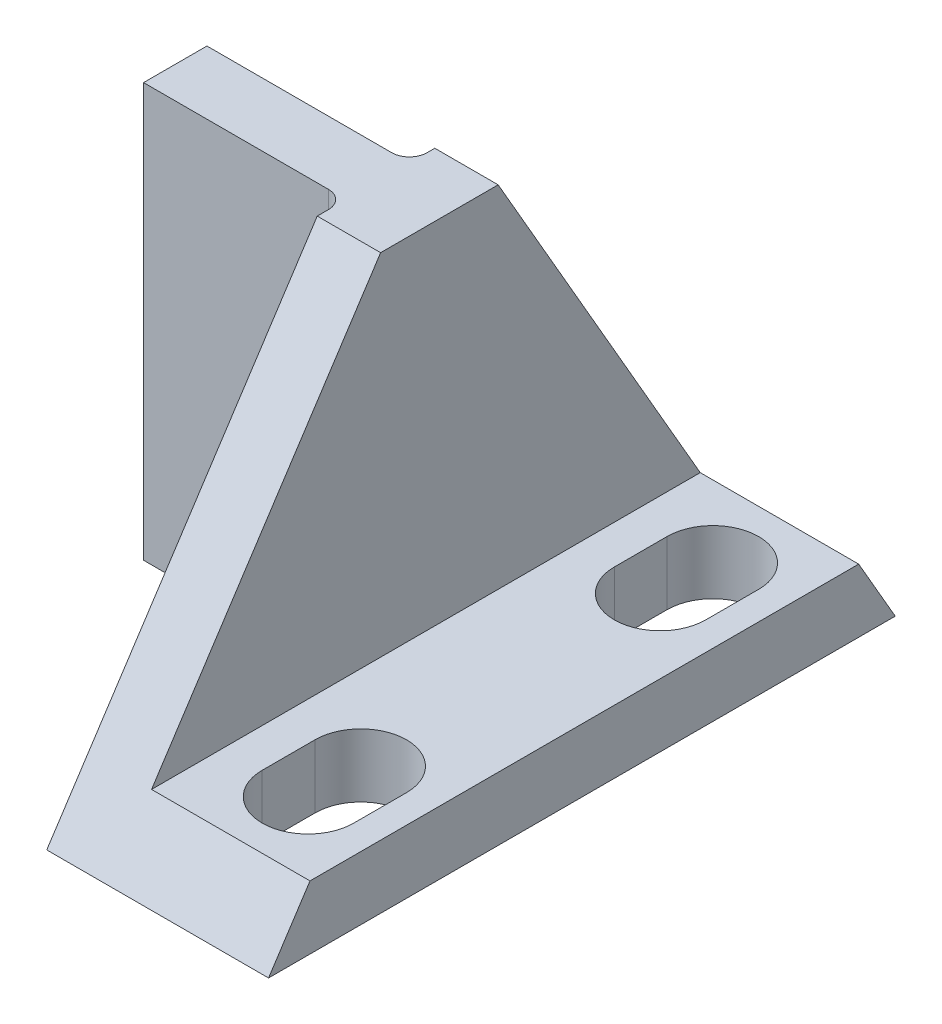
ISO-10303-21;
HEADER;
FILE_DESCRIPTION(('STEP AP214'),'2;1');
FILE_NAME('part.step','',(''),(''),'','','');
FILE_SCHEMA(('AUTOMOTIVE_DESIGN { 1 0 10303 214 1 1 1 1 }'));
ENDSEC;
DATA;
#1=APPLICATION_CONTEXT('core data for automotive mechanical design processes');
#2=APPLICATION_PROTOCOL_DEFINITION('international standard','automotive_design',2000,#1);
#3=PRODUCT_CONTEXT('',#1,'mechanical');
#4=PRODUCT('Part','Part','',(#3));
#5=PRODUCT_RELATED_PRODUCT_CATEGORY('part','',(#4));
#6=PRODUCT_DEFINITION_FORMATION('','',#4);
#7=PRODUCT_DEFINITION_CONTEXT('part definition',#1,'design');
#8=PRODUCT_DEFINITION('design','',#6,#7);
#9=PRODUCT_DEFINITION_SHAPE('','',#8);
#10=(LENGTH_UNIT() NAMED_UNIT(*) SI_UNIT(.MILLI.,.METRE.));
#11=(NAMED_UNIT(*) PLANE_ANGLE_UNIT() SI_UNIT($,.RADIAN.));
#12=(NAMED_UNIT(*) SI_UNIT($,.STERADIAN.) SOLID_ANGLE_UNIT());
#13=UNCERTAINTY_MEASURE_WITH_UNIT(LENGTH_MEASURE(1.E-05),#10,'distance_accuracy_value','');
#14=(GEOMETRIC_REPRESENTATION_CONTEXT(3) GLOBAL_UNCERTAINTY_ASSIGNED_CONTEXT((#13)) GLOBAL_UNIT_ASSIGNED_CONTEXT((#10,
#11,#12)) REPRESENTATION_CONTEXT('',''));
#15=CARTESIAN_POINT('',(0.,0.,0.));
#16=DIRECTION('',(0.,0.,1.));
#17=DIRECTION('',(1.,0.,0.));
#18=AXIS2_PLACEMENT_3D('',#15,#16,#17);
#19=CARTESIAN_POINT('',(0.,0.,4.572));
#20=DIRECTION('',(1.,0.,0.));
#21=DIRECTION('',(0.,0.,-1.));
#22=AXIS2_PLACEMENT_3D('',#19,#20,#21);
#23=PLANE('',#22);
#24=CARTESIAN_POINT('',(0.,13.97,2.286));
#25=DIRECTION('',(-1.,0.,0.));
#26=DIRECTION('',(0.,0.,1.));
#27=AXIS2_PLACEMENT_3D('',#24,#25,#26);
#28=CIRCLE('',#27,1.25);
#29=CARTESIAN_POINT('',(0.,13.97,3.536));
#30=VERTEX_POINT('',#29);
#31=EDGE_CURVE('E174',#30,#30,#28,.T.);
#32=ORIENTED_EDGE('',*,*,#31,.F.);
#33=EDGE_LOOP('',(#32));
#34=FACE_BOUND('',#33,.T.);
#35=CARTESIAN_POINT('',(0.,26.67,2.286));
#36=DIRECTION('',(-1.,0.,0.));
#37=DIRECTION('',(0.,0.,1.));
#38=AXIS2_PLACEMENT_3D('',#35,#36,#37);
#39=CIRCLE('',#38,1.25000004);
#40=CARTESIAN_POINT('',(0.,26.67,3.53600004));
#41=VERTEX_POINT('',#40);
#42=EDGE_CURVE('E345',#41,#41,#39,.T.);
#43=ORIENTED_EDGE('',*,*,#42,.F.);
#44=EDGE_LOOP('',(#43));
#45=FACE_BOUND('',#44,.T.);
#46=DIRECTION('',(0.,0.,1.));
#47=VECTOR('',#46,1.);
#48=CARTESIAN_POINT('',(0.,29.845,-6.0398679210479));
#49=LINE('',#48,#47);
#50=CARTESIAN_POINT('',(0.,29.845,0.));
#51=VERTEX_POINT('',#50);
#52=CARTESIAN_POINT('',(0.,29.845,4.572));
#53=VERTEX_POINT('',#52);
#54=EDGE_CURVE('E171',#51,#53,#49,.T.);
#55=ORIENTED_EDGE('',*,*,#54,.F.);
#56=DIRECTION('',(0.,-1.,0.));
#57=VECTOR('',#56,1.);
#58=CARTESIAN_POINT('',(0.,0.,0.));
#59=LINE('',#58,#57);
#60=CARTESIAN_POINT('',(0.,0.,0.));
#61=VERTEX_POINT('',#60);
#62=EDGE_CURVE('E180',#51,#61,#59,.T.);
#63=ORIENTED_EDGE('',*,*,#62,.T.);
#64=DIRECTION('',(0.,0.,-1.));
#65=VECTOR('',#64,1.);
#66=CARTESIAN_POINT('',(0.,0.,4.572));
#67=LINE('',#66,#65);
#68=CARTESIAN_POINT('',(0.,0.,4.572));
#69=VERTEX_POINT('',#68);
#70=EDGE_CURVE('E197',#69,#61,#67,.T.);
#71=ORIENTED_EDGE('',*,*,#70,.F.);
#72=DIRECTION('',(0.,-1.,0.));
#73=VECTOR('',#72,1.);
#74=CARTESIAN_POINT('',(0.,0.,4.572));
#75=LINE('',#74,#73);
#76=EDGE_CURVE('E181',#53,#69,#75,.T.);
#77=ORIENTED_EDGE('',*,*,#76,.F.);
#78=EDGE_LOOP('',(#55,#63,#71,#77));
#79=FACE_BOUND('',#78,.T.);
#80=ADVANCED_FACE('F34',(#34,#45,#79),#23,.F.);
#81=CARTESIAN_POINT('',(0.,0.,4.572));
#82=DIRECTION('',(0.,0.,-1.));
#83=DIRECTION('',(-1.,0.,0.));
#84=AXIS2_PLACEMENT_3D('',#81,#82,#83);
#85=PLANE('',#84);
#86=DIRECTION('',(1.,0.,0.));
#87=VECTOR('',#86,1.);
#88=CARTESIAN_POINT('',(0.,0.,4.572));
#89=LINE('',#88,#87);
#90=CARTESIAN_POINT('',(13.335,0.,4.572));
#91=VERTEX_POINT('',#90);
#92=EDGE_CURVE('E194',#69,#91,#89,.T.);
#93=ORIENTED_EDGE('',*,*,#92,.T.);
#94=DIRECTION('',(0.,1.,0.));
#95=VECTOR('',#94,1.);
#96=CARTESIAN_POINT('',(13.335,29.845,4.572));
#97=LINE('',#96,#95);
#98=CARTESIAN_POINT('',(13.335,29.845,4.572));
#99=VERTEX_POINT('',#98);
#100=EDGE_CURVE('E201',#91,#99,#97,.T.);
#101=ORIENTED_EDGE('',*,*,#100,.T.);
#102=DIRECTION('',(1.,0.,0.));
#103=VECTOR('',#102,1.);
#104=CARTESIAN_POINT('',(0.,29.845,4.572));
#105=LINE('',#104,#103);
#106=EDGE_CURVE('E229',#53,#99,#105,.T.);
#107=ORIENTED_EDGE('',*,*,#106,.F.);
#108=ORIENTED_EDGE('',*,*,#76,.T.);
#109=EDGE_LOOP('',(#93,#101,#107,#108));
#110=FACE_BOUND('',#109,.T.);
#111=ADVANCED_FACE('F225',(#110),#85,.F.);
#112=CARTESIAN_POINT('',(0.,0.,0.));
#113=DIRECTION('',(0.,0.,-1.));
#114=DIRECTION('',(-1.,0.,0.));
#115=AXIS2_PLACEMENT_3D('',#112,#113,#114);
#116=PLANE('',#115);
#117=DIRECTION('',(1.,0.,0.));
#118=VECTOR('',#117,1.);
#119=CARTESIAN_POINT('',(0.,29.845,0.));
#120=LINE('',#119,#118);
#121=CARTESIAN_POINT('',(13.335,29.845,0.));
#122=VERTEX_POINT('',#121);
#123=EDGE_CURVE('E167',#51,#122,#120,.T.);
#124=ORIENTED_EDGE('',*,*,#123,.T.);
#125=DIRECTION('',(0.,1.,0.));
#126=VECTOR('',#125,1.);
#127=CARTESIAN_POINT('',(13.335,0.,0.));
#128=LINE('',#127,#126);
#129=CARTESIAN_POINT('',(13.335,0.,0.));
#130=VERTEX_POINT('',#129);
#131=EDGE_CURVE('E49',#122,#130,#128,.F.);
#132=ORIENTED_EDGE('',*,*,#131,.T.);
#133=DIRECTION('',(1.,0.,0.));
#134=VECTOR('',#133,1.);
#135=CARTESIAN_POINT('',(0.,0.,0.));
#136=LINE('',#135,#134);
#137=EDGE_CURVE('E185',#61,#130,#136,.T.);
#138=ORIENTED_EDGE('',*,*,#137,.F.);
#139=ORIENTED_EDGE('',*,*,#62,.F.);
#140=EDGE_LOOP('',(#124,#132,#138,#139));
#141=FACE_BOUND('',#140,.T.);
#142=ADVANCED_FACE('F184',(#141),#116,.T.);
#143=CARTESIAN_POINT('',(14.605,0.,0.));
#144=DIRECTION('',(1.,0.,0.));
#145=DIRECTION('',(0.,0.,-1.));
#146=AXIS2_PLACEMENT_3D('',#143,#144,#145);
#147=PLANE('',#146);
#148=DIRECTION('',(0.,0.,-1.));
#149=VECTOR('',#148,1.);
#150=CARTESIAN_POINT('',(14.605,0.,26.162));
#151=LINE('',#150,#149);
#152=CARTESIAN_POINT('',(14.605,0.,-1.26999999999999));
#153=VERTEX_POINT('',#152);
#154=CARTESIAN_POINT('',(14.605,0.,-19.05));
#155=VERTEX_POINT('',#154);
#156=EDGE_CURVE('E235',#153,#155,#151,.T.);
#157=ORIENTED_EDGE('',*,*,#156,.F.);
#158=DIRECTION('',(0.,1.,0.));
#159=VECTOR('',#158,1.);
#160=CARTESIAN_POINT('',(14.605,0.,-1.27));
#161=LINE('',#160,#159);
#162=CARTESIAN_POINT('',(14.605,29.845,-1.27));
#163=VERTEX_POINT('',#162);
#164=EDGE_CURVE('E206',#153,#163,#161,.T.);
#165=ORIENTED_EDGE('',*,*,#164,.T.);
#166=DIRECTION('',(0.,0.,1.));
#167=VECTOR('',#166,1.);
#168=CARTESIAN_POINT('',(14.605,29.845,0.));
#169=LINE('',#168,#167);
#170=CARTESIAN_POINT('',(14.605,29.845,-1.83173076923077));
#171=VERTEX_POINT('',#170);
#172=EDGE_CURVE('E175',#171,#163,#169,.T.);
#173=ORIENTED_EDGE('',*,*,#172,.F.);
#174=DIRECTION('',(0.,0.866185586048601,0.499722453489577));
#175=VECTOR('',#174,1.);
#176=CARTESIAN_POINT('',(14.605,0.,-19.05));
#177=LINE('',#176,#175);
#178=EDGE_CURVE('E246',#155,#171,#177,.T.);
#179=ORIENTED_EDGE('',*,*,#178,.F.);
#180=EDGE_LOOP('',(#157,#165,#173,#179));
#181=FACE_BOUND('',#180,.T.);
#182=ADVANCED_FACE('F369',(#181),#147,.F.);
#183=CARTESIAN_POINT('',(19.177,33.02,4.572));
#184=DIRECTION('',(0.,-0.547249362982703,-0.836969613973546));
#185=DIRECTION('',(0.,0.836969613973546,-0.547249362982703));
#186=AXIS2_PLACEMENT_3D('',#183,#184,#185);
#187=PLANE('',#186);
#188=DIRECTION('',(1.,0.,0.));
#189=VECTOR('',#188,1.);
#190=CARTESIAN_POINT('',(19.177,29.845,6.64796153846154));
#191=LINE('',#190,#189);
#192=CARTESIAN_POINT('',(14.605,29.845,6.64796153846154));
#193=VERTEX_POINT('',#192);
#194=CARTESIAN_POINT('',(19.177,29.845,6.64796153846154));
#195=VERTEX_POINT('',#194);
#196=EDGE_CURVE('E182',#193,#195,#191,.T.);
#197=ORIENTED_EDGE('',*,*,#196,.F.);
#198=DIRECTION('',(0.,-0.836969613973546,0.547249362982703));
#199=VECTOR('',#198,1.);
#200=CARTESIAN_POINT('',(14.605,33.02,4.572));
#201=LINE('',#200,#199);
#202=CARTESIAN_POINT('',(14.605,0.,26.162));
#203=VERTEX_POINT('',#202);
#204=EDGE_CURVE('E233',#193,#203,#201,.T.);
#205=ORIENTED_EDGE('',*,*,#204,.T.);
#206=DIRECTION('',(-1.,0.,0.));
#207=VECTOR('',#206,1.);
#208=CARTESIAN_POINT('',(19.177,0.,26.162));
#209=LINE('',#208,#207);
#210=CARTESIAN_POINT('',(30.607,0.,26.162));
#211=VERTEX_POINT('',#210);
#212=EDGE_CURVE('E187',#211,#203,#209,.T.);
#213=ORIENTED_EDGE('',*,*,#212,.F.);
#214=DIRECTION('',(0.,-0.836969613973546,0.547249362982702));
#215=VECTOR('',#214,1.);
#216=CARTESIAN_POINT('',(30.607,0.,26.162));
#217=LINE('',#216,#215);
#218=CARTESIAN_POINT('',(30.607,4.57199999999999,23.1726153846154));
#219=VERTEX_POINT('',#218);
#220=EDGE_CURVE('E266',#219,#211,#217,.T.);
#221=ORIENTED_EDGE('',*,*,#220,.F.);
#222=DIRECTION('',(-1.,0.,0.));
#223=VECTOR('',#222,1.);
#224=CARTESIAN_POINT('',(30.607,4.57199999999999,23.1726153846154));
#225=LINE('',#224,#223);
#226=CARTESIAN_POINT('',(19.177,4.57199999999999,23.1726153846154));
#227=VERTEX_POINT('',#226);
#228=EDGE_CURVE('E240',#219,#227,#225,.T.);
#229=ORIENTED_EDGE('',*,*,#228,.T.);
#230=DIRECTION('',(0.,-0.836969613973546,0.547249362982703));
#231=VECTOR('',#230,1.);
#232=CARTESIAN_POINT('',(19.177,33.02,4.572));
#233=LINE('',#232,#231);
#234=EDGE_CURVE('E249',#195,#227,#233,.T.);
#235=ORIENTED_EDGE('',*,*,#234,.F.);
#236=EDGE_LOOP('',(#197,#205,#213,#221,#229,#235));
#237=FACE_BOUND('',#236,.T.);
#238=ADVANCED_FACE('F358',(#237),#187,.F.);
#239=CARTESIAN_POINT('',(19.177,0.,-19.05));
#240=DIRECTION('',(0.,-0.499722453489577,0.8661855860486));
#241=DIRECTION('',(0.,-0.8661855860486,-0.499722453489577));
#242=AXIS2_PLACEMENT_3D('',#239,#240,#241);
#243=PLANE('',#242);
#244=DIRECTION('',(-1.,0.,0.));
#245=VECTOR('',#244,1.);
#246=CARTESIAN_POINT('',(19.177,29.845,-1.83173076923077));
#247=LINE('',#246,#245);
#248=CARTESIAN_POINT('',(19.177,29.845,-1.83173076923077));
#249=VERTEX_POINT('',#248);
#250=EDGE_CURVE('E351',#249,#171,#247,.T.);
#251=ORIENTED_EDGE('',*,*,#250,.F.);
#252=DIRECTION('',(0.,0.866185586048601,0.499722453489577));
#253=VECTOR('',#252,1.);
#254=CARTESIAN_POINT('',(19.177,0.,-19.05));
#255=LINE('',#254,#253);
#256=CARTESIAN_POINT('',(19.177,4.572,-16.4123076923077));
#257=VERTEX_POINT('',#256);
#258=EDGE_CURVE('E243',#257,#249,#255,.T.);
#259=ORIENTED_EDGE('',*,*,#258,.F.);
#260=DIRECTION('',(-1.,0.,0.));
#261=VECTOR('',#260,1.);
#262=CARTESIAN_POINT('',(30.607,4.57199999999999,-16.4123076923077));
#263=LINE('',#262,#261);
#264=CARTESIAN_POINT('',(30.607,4.57199999999999,-16.4123076923077));
#265=VERTEX_POINT('',#264);
#266=EDGE_CURVE('E236',#265,#257,#263,.T.);
#267=ORIENTED_EDGE('',*,*,#266,.F.);
#268=DIRECTION('',(0.,0.866185586048601,0.499722453489577));
#269=VECTOR('',#268,1.);
#270=CARTESIAN_POINT('',(30.607,4.57199999999999,-16.4123076923077));
#271=LINE('',#270,#269);
#272=CARTESIAN_POINT('',(30.607,0.,-19.05));
#273=VERTEX_POINT('',#272);
#274=EDGE_CURVE('E269',#273,#265,#271,.T.);
#275=ORIENTED_EDGE('',*,*,#274,.F.);
#276=DIRECTION('',(-1.,0.,0.));
#277=VECTOR('',#276,1.);
#278=CARTESIAN_POINT('',(19.177,0.,-19.05));
#279=LINE('',#278,#277);
#280=EDGE_CURVE('E191',#273,#155,#279,.T.);
#281=ORIENTED_EDGE('',*,*,#280,.T.);
#282=ORIENTED_EDGE('',*,*,#178,.T.);
#283=EDGE_LOOP('',(#251,#259,#267,#275,#281,#282));
#284=FACE_BOUND('',#283,.T.);
#285=ADVANCED_FACE('F365',(#284),#243,.F.);
#286=CARTESIAN_POINT('',(19.177,0.,0.));
#287=DIRECTION('',(1.,0.,0.));
#288=DIRECTION('',(0.,0.,-1.));
#289=AXIS2_PLACEMENT_3D('',#286,#287,#288);
#290=PLANE('',#289);
#291=ORIENTED_EDGE('',*,*,#258,.T.);
#292=DIRECTION('',(0.,0.,1.));
#293=VECTOR('',#292,1.);
#294=CARTESIAN_POINT('',(19.177,29.845,0.));
#295=LINE('',#294,#293);
#296=EDGE_CURVE('E353',#249,#195,#295,.T.);
#297=ORIENTED_EDGE('',*,*,#296,.T.);
#298=ORIENTED_EDGE('',*,*,#234,.T.);
#299=DIRECTION('',(0.,0.,1.));
#300=VECTOR('',#299,1.);
#301=CARTESIAN_POINT('',(19.177,4.57199999999999,23.1726153846154));
#302=LINE('',#301,#300);
#303=EDGE_CURVE('E264',#257,#227,#302,.T.);
#304=ORIENTED_EDGE('',*,*,#303,.F.);
#305=EDGE_LOOP('',(#291,#297,#298,#304));
#306=FACE_BOUND('',#305,.T.);
#307=ADVANCED_FACE('F357',(#306),#290,.T.);
#308=DIRECTION('',(0.,0.,1.));
#309=VECTOR('',#308,1.);
#310=CARTESIAN_POINT('',(14.605,29.845,0.));
#311=LINE('',#310,#309);
#312=CARTESIAN_POINT('',(14.605,29.845,5.842));
#313=VERTEX_POINT('',#312);
#314=EDGE_CURVE('E199',#313,#193,#311,.T.);
#315=ORIENTED_EDGE('',*,*,#314,.F.);
#316=DIRECTION('',(0.,1.,0.));
#317=VECTOR('',#316,1.);
#318=CARTESIAN_POINT('',(14.605,0.,5.842));
#319=LINE('',#318,#317);
#320=CARTESIAN_POINT('',(14.605,0.,5.84200000000001));
#321=VERTEX_POINT('',#320);
#322=EDGE_CURVE('E204',#313,#321,#319,.F.);
#323=ORIENTED_EDGE('',*,*,#322,.T.);
#324=EDGE_CURVE('E220',#203,#321,#151,.T.);
#325=ORIENTED_EDGE('',*,*,#324,.F.);
#326=ORIENTED_EDGE('',*,*,#204,.F.);
#327=EDGE_LOOP('',(#315,#323,#325,#326));
#328=FACE_BOUND('',#327,.T.);
#329=ADVANCED_FACE('F232',(#328),#147,.F.);
#330=CARTESIAN_POINT('',(0.,0.,4.572));
#331=DIRECTION('',(0.,1.,0.));
#332=DIRECTION('',(0.,0.,1.));
#333=AXIS2_PLACEMENT_3D('',#330,#331,#332);
#334=PLANE('',#333);
#335=DIRECTION('',(0.,0.,-1.));
#336=VECTOR('',#335,1.);
#337=CARTESIAN_POINT('',(28.575,0.,-11.2248461538462));
#338=LINE('',#337,#336);
#339=CARTESIAN_POINT('',(28.575,0.,-7.41484615384615));
#340=VERTEX_POINT('',#339);
#341=CARTESIAN_POINT('',(28.575,0.,-11.2248461538462));
#342=VERTEX_POINT('',#341);
#343=EDGE_CURVE('E314',#340,#342,#338,.T.);
#344=ORIENTED_EDGE('',*,*,#343,.T.);
#345=CARTESIAN_POINT('',(25.273,0.,-11.2248461538462));
#346=DIRECTION('',(0.,1.,0.));
#347=DIRECTION('',(0.,0.,1.));
#348=AXIS2_PLACEMENT_3D('',#345,#346,#347);
#349=CIRCLE('',#348,3.302);
#350=CARTESIAN_POINT('',(21.971,0.,-11.2248461538461));
#351=VERTEX_POINT('',#350);
#352=EDGE_CURVE('E322',#342,#351,#349,.T.);
#353=ORIENTED_EDGE('',*,*,#352,.T.);
#354=DIRECTION('',(0.,0.,1.));
#355=VECTOR('',#354,1.);
#356=CARTESIAN_POINT('',(21.971,0.,-11.2248461538461));
#357=LINE('',#356,#355);
#358=CARTESIAN_POINT('',(21.971,0.,-7.41484615384615));
#359=VERTEX_POINT('',#358);
#360=EDGE_CURVE('E335',#351,#359,#357,.T.);
#361=ORIENTED_EDGE('',*,*,#360,.T.);
#362=CARTESIAN_POINT('',(25.273,0.,-7.41484615384615));
#363=DIRECTION('',(0.,1.,0.));
#364=DIRECTION('',(0.,0.,1.));
#365=AXIS2_PLACEMENT_3D('',#362,#363,#364);
#366=CIRCLE('',#365,3.302);
#367=EDGE_CURVE('E332',#359,#340,#366,.T.);
#368=ORIENTED_EDGE('',*,*,#367,.T.);
#369=EDGE_LOOP('',(#344,#353,#361,#368));
#370=FACE_BOUND('',#369,.T.);
#371=DIRECTION('',(0.,0.,-1.));
#372=VECTOR('',#371,1.);
#373=CARTESIAN_POINT('',(28.575,0.,14.1751538461538));
#374=LINE('',#373,#372);
#375=CARTESIAN_POINT('',(28.575,0.,17.9851538461538));
#376=VERTEX_POINT('',#375);
#377=CARTESIAN_POINT('',(28.575,0.,14.1751538461538));
#378=VERTEX_POINT('',#377);
#379=EDGE_CURVE('E280',#376,#378,#374,.T.);
#380=ORIENTED_EDGE('',*,*,#379,.T.);
#381=CARTESIAN_POINT('',(25.273,0.,14.1751538461538));
#382=DIRECTION('',(0.,1.,0.));
#383=DIRECTION('',(0.,0.,1.));
#384=AXIS2_PLACEMENT_3D('',#381,#382,#383);
#385=CIRCLE('',#384,3.302);
#386=CARTESIAN_POINT('',(21.971,0.,14.1751538461538));
#387=VERTEX_POINT('',#386);
#388=EDGE_CURVE('E290',#378,#387,#385,.T.);
#389=ORIENTED_EDGE('',*,*,#388,.T.);
#390=DIRECTION('',(0.,0.,1.));
#391=VECTOR('',#390,1.);
#392=CARTESIAN_POINT('',(21.971,0.,14.1751538461538));
#393=LINE('',#392,#391);
#394=CARTESIAN_POINT('',(21.971,0.,17.9851538461539));
#395=VERTEX_POINT('',#394);
#396=EDGE_CURVE('E305',#387,#395,#393,.T.);
#397=ORIENTED_EDGE('',*,*,#396,.T.);
#398=CARTESIAN_POINT('',(25.273,0.,17.9851538461538));
#399=DIRECTION('',(0.,1.,0.));
#400=DIRECTION('',(0.,0.,1.));
#401=AXIS2_PLACEMENT_3D('',#398,#399,#400);
#402=CIRCLE('',#401,3.302);
#403=EDGE_CURVE('E302',#395,#376,#402,.T.);
#404=ORIENTED_EDGE('',*,*,#403,.T.);
#405=EDGE_LOOP('',(#380,#389,#397,#404));
#406=FACE_BOUND('',#405,.T.);
#407=ORIENTED_EDGE('',*,*,#137,.T.);
#408=CARTESIAN_POINT('',(13.335,0.,-1.27));
#409=DIRECTION('',(0.,1.,0.));
#410=DIRECTION('',(0.,0.,1.));
#411=AXIS2_PLACEMENT_3D('',#408,#409,#410);
#412=CIRCLE('',#411,1.27);
#413=EDGE_CURVE('E11',#130,#153,#412,.T.);
#414=ORIENTED_EDGE('',*,*,#413,.T.);
#415=ORIENTED_EDGE('',*,*,#156,.T.);
#416=ORIENTED_EDGE('',*,*,#280,.F.);
#417=DIRECTION('',(0.,0.,-1.));
#418=VECTOR('',#417,1.);
#419=CARTESIAN_POINT('',(30.607,0.,-19.05));
#420=LINE('',#419,#418);
#421=EDGE_CURVE('E271',#211,#273,#420,.T.);
#422=ORIENTED_EDGE('',*,*,#421,.F.);
#423=ORIENTED_EDGE('',*,*,#212,.T.);
#424=ORIENTED_EDGE('',*,*,#324,.T.);
#425=CARTESIAN_POINT('',(13.335,0.,5.842));
#426=DIRECTION('',(0.,1.,0.));
#427=DIRECTION('',(0.,0.,1.));
#428=AXIS2_PLACEMENT_3D('',#425,#426,#427);
#429=CIRCLE('',#428,1.27);
#430=EDGE_CURVE('E212',#321,#91,#429,.T.);
#431=ORIENTED_EDGE('',*,*,#430,.T.);
#432=ORIENTED_EDGE('',*,*,#92,.F.);
#433=ORIENTED_EDGE('',*,*,#70,.T.);
#434=EDGE_LOOP('',(#407,#414,#415,#416,#422,#423,#424,#431,#432,#433));
#435=FACE_BOUND('',#434,.T.);
#436=ADVANCED_FACE('F218',(#370,#406,#435),#334,.F.);
#437=CARTESIAN_POINT('',(30.607,4.57199999999999,23.1726153846154));
#438=DIRECTION('',(0.,-1.,0.));
#439=DIRECTION('',(0.,0.,-1.));
#440=AXIS2_PLACEMENT_3D('',#437,#438,#439);
#441=PLANE('',#440);
#442=DIRECTION('',(0.,0.,1.));
#443=VECTOR('',#442,1.);
#444=CARTESIAN_POINT('',(21.971,4.57199999999999,-11.2248461538461));
#445=LINE('',#444,#443);
#446=CARTESIAN_POINT('',(21.971,4.57199999999999,-11.2248461538462));
#447=VERTEX_POINT('',#446);
#448=CARTESIAN_POINT('',(21.971,4.57199999999999,-7.41484615384615));
#449=VERTEX_POINT('',#448);
#450=EDGE_CURVE('E326',#447,#449,#445,.T.);
#451=ORIENTED_EDGE('',*,*,#450,.F.);
#452=CARTESIAN_POINT('',(25.273,4.57199999999999,-11.2248461538462));
#453=DIRECTION('',(0.,1.,0.));
#454=DIRECTION('',(0.,0.,1.));
#455=AXIS2_PLACEMENT_3D('',#452,#453,#454);
#456=CIRCLE('',#455,3.302);
#457=CARTESIAN_POINT('',(28.575,4.57199999999999,-11.2248461538462));
#458=VERTEX_POINT('',#457);
#459=EDGE_CURVE('E286',#458,#447,#456,.T.);
#460=ORIENTED_EDGE('',*,*,#459,.F.);
#461=DIRECTION('',(0.,0.,-1.));
#462=VECTOR('',#461,1.);
#463=CARTESIAN_POINT('',(28.575,4.57199999999999,-11.2248461538462));
#464=LINE('',#463,#462);
#465=CARTESIAN_POINT('',(28.575,4.57199999999999,-7.41484615384615));
#466=VERTEX_POINT('',#465);
#467=EDGE_CURVE('E319',#466,#458,#464,.T.);
#468=ORIENTED_EDGE('',*,*,#467,.F.);
#469=CARTESIAN_POINT('',(25.273,4.57199999999999,-7.41484615384615));
#470=DIRECTION('',(0.,1.,0.));
#471=DIRECTION('',(0.,0.,1.));
#472=AXIS2_PLACEMENT_3D('',#469,#470,#471);
#473=CIRCLE('',#472,3.302);
#474=EDGE_CURVE('E323',#449,#466,#473,.T.);
#475=ORIENTED_EDGE('',*,*,#474,.F.);
#476=EDGE_LOOP('',(#451,#460,#468,#475));
#477=FACE_BOUND('',#476,.T.);
#478=DIRECTION('',(0.,0.,1.));
#479=VECTOR('',#478,1.);
#480=CARTESIAN_POINT('',(21.971,4.57199999999999,14.1751538461538));
#481=LINE('',#480,#479);
#482=CARTESIAN_POINT('',(21.971,4.57199999999999,14.1751538461538));
#483=VERTEX_POINT('',#482);
#484=CARTESIAN_POINT('',(21.971,4.57199999999999,17.9851538461538));
#485=VERTEX_POINT('',#484);
#486=EDGE_CURVE('E294',#483,#485,#481,.T.);
#487=ORIENTED_EDGE('',*,*,#486,.F.);
#488=CARTESIAN_POINT('',(25.273,4.57199999999999,14.1751538461538));
#489=DIRECTION('',(0.,1.,0.));
#490=DIRECTION('',(0.,0.,1.));
#491=AXIS2_PLACEMENT_3D('',#488,#489,#490);
#492=CIRCLE('',#491,3.302);
#493=CARTESIAN_POINT('',(28.575,4.57199999999999,14.1751538461538));
#494=VERTEX_POINT('',#493);
#495=EDGE_CURVE('E297',#494,#483,#492,.T.);
#496=ORIENTED_EDGE('',*,*,#495,.F.);
#497=DIRECTION('',(0.,0.,-1.));
#498=VECTOR('',#497,1.);
#499=CARTESIAN_POINT('',(28.575,4.57199999999999,14.1751538461538));
#500=LINE('',#499,#498);
#501=CARTESIAN_POINT('',(28.575,4.57199999999999,17.9851538461538));
#502=VERTEX_POINT('',#501);
#503=EDGE_CURVE('E287',#502,#494,#500,.T.);
#504=ORIENTED_EDGE('',*,*,#503,.F.);
#505=CARTESIAN_POINT('',(25.273,4.57199999999999,17.9851538461538));
#506=DIRECTION('',(0.,1.,0.));
#507=DIRECTION('',(0.,0.,1.));
#508=AXIS2_PLACEMENT_3D('',#505,#506,#507);
#509=CIRCLE('',#508,3.302);
#510=EDGE_CURVE('E291',#485,#502,#509,.T.);
#511=ORIENTED_EDGE('',*,*,#510,.F.);
#512=EDGE_LOOP('',(#487,#496,#504,#511));
#513=FACE_BOUND('',#512,.T.);
#514=ORIENTED_EDGE('',*,*,#303,.T.);
#515=ORIENTED_EDGE('',*,*,#228,.F.);
#516=DIRECTION('',(0.,0.,1.));
#517=VECTOR('',#516,1.);
#518=CARTESIAN_POINT('',(30.607,4.57199999999999,23.1726153846154));
#519=LINE('',#518,#517);
#520=EDGE_CURVE('E263',#265,#219,#519,.T.);
#521=ORIENTED_EDGE('',*,*,#520,.F.);
#522=ORIENTED_EDGE('',*,*,#266,.T.);
#523=EDGE_LOOP('',(#514,#515,#521,#522));
#524=FACE_BOUND('',#523,.T.);
#525=ADVANCED_FACE('F363',(#477,#513,#524),#441,.F.);
#526=CARTESIAN_POINT('',(30.607,0.,0.));
#527=DIRECTION('',(-1.,0.,0.));
#528=DIRECTION('',(0.,0.,1.));
#529=AXIS2_PLACEMENT_3D('',#526,#527,#528);
#530=PLANE('',#529);
#531=ORIENTED_EDGE('',*,*,#220,.T.);
#532=ORIENTED_EDGE('',*,*,#421,.T.);
#533=ORIENTED_EDGE('',*,*,#274,.T.);
#534=ORIENTED_EDGE('',*,*,#520,.T.);
#535=EDGE_LOOP('',(#531,#532,#533,#534));
#536=FACE_BOUND('',#535,.T.);
#537=ADVANCED_FACE('F375',(#536),#530,.F.);
#538=CARTESIAN_POINT('',(25.273,0.,14.1751538461538));
#539=DIRECTION('',(0.,1.,0.));
#540=DIRECTION('',(0.,0.,1.));
#541=AXIS2_PLACEMENT_3D('',#538,#539,#540);
#542=CYLINDRICAL_SURFACE('',#541,3.302);
#543=ORIENTED_EDGE('',*,*,#495,.T.);
#544=DIRECTION('',(0.,1.,0.));
#545=VECTOR('',#544,1.);
#546=CARTESIAN_POINT('',(21.971,0.,14.1751538461538));
#547=LINE('',#546,#545);
#548=EDGE_CURVE('E276',#387,#483,#547,.T.);
#549=ORIENTED_EDGE('',*,*,#548,.F.);
#550=ORIENTED_EDGE('',*,*,#388,.F.);
#551=DIRECTION('',(0.,1.,0.));
#552=VECTOR('',#551,1.);
#553=CARTESIAN_POINT('',(28.575,0.,14.1751538461538));
#554=LINE('',#553,#552);
#555=EDGE_CURVE('E284',#378,#494,#554,.T.);
#556=ORIENTED_EDGE('',*,*,#555,.T.);
#557=EDGE_LOOP('',(#543,#549,#550,#556));
#558=FACE_BOUND('',#557,.T.);
#559=ADVANCED_FACE('F377',(#558),#542,.F.);
#560=CARTESIAN_POINT('',(28.575,0.,14.1751538461538));
#561=DIRECTION('',(1.,0.,0.));
#562=DIRECTION('',(0.,0.,-1.));
#563=AXIS2_PLACEMENT_3D('',#560,#561,#562);
#564=PLANE('',#563);
#565=ORIENTED_EDGE('',*,*,#503,.T.);
#566=ORIENTED_EDGE('',*,*,#555,.F.);
#567=ORIENTED_EDGE('',*,*,#379,.F.);
#568=DIRECTION('',(0.,1.,0.));
#569=VECTOR('',#568,1.);
#570=CARTESIAN_POINT('',(28.575,0.,17.9851538461538));
#571=LINE('',#570,#569);
#572=EDGE_CURVE('E282',#376,#502,#571,.T.);
#573=ORIENTED_EDGE('',*,*,#572,.T.);
#574=EDGE_LOOP('',(#565,#566,#567,#573));
#575=FACE_BOUND('',#574,.T.);
#576=ADVANCED_FACE('F383',(#575),#564,.F.);
#577=CARTESIAN_POINT('',(25.273,0.,17.9851538461538));
#578=DIRECTION('',(0.,1.,0.));
#579=DIRECTION('',(0.,0.,1.));
#580=AXIS2_PLACEMENT_3D('',#577,#578,#579);
#581=CYLINDRICAL_SURFACE('',#580,3.302);
#582=ORIENTED_EDGE('',*,*,#510,.T.);
#583=ORIENTED_EDGE('',*,*,#572,.F.);
#584=ORIENTED_EDGE('',*,*,#403,.F.);
#585=DIRECTION('',(0.,1.,0.));
#586=VECTOR('',#585,1.);
#587=CARTESIAN_POINT('',(21.971,0.,17.9851538461538));
#588=LINE('',#587,#586);
#589=EDGE_CURVE('E279',#395,#485,#588,.T.);
#590=ORIENTED_EDGE('',*,*,#589,.T.);
#591=EDGE_LOOP('',(#582,#583,#584,#590));
#592=FACE_BOUND('',#591,.T.);
#593=ADVANCED_FACE('F443',(#592),#581,.F.);
#594=CARTESIAN_POINT('',(21.971,0.,14.1751538461538));
#595=DIRECTION('',(-1.,0.,0.));
#596=DIRECTION('',(0.,0.,1.));
#597=AXIS2_PLACEMENT_3D('',#594,#595,#596);
#598=PLANE('',#597);
#599=ORIENTED_EDGE('',*,*,#486,.T.);
#600=ORIENTED_EDGE('',*,*,#589,.F.);
#601=ORIENTED_EDGE('',*,*,#396,.F.);
#602=ORIENTED_EDGE('',*,*,#548,.T.);
#603=EDGE_LOOP('',(#599,#600,#601,#602));
#604=FACE_BOUND('',#603,.T.);
#605=ADVANCED_FACE('F439',(#604),#598,.F.);
#606=CARTESIAN_POINT('',(25.273,0.,-11.2248461538462));
#607=DIRECTION('',(0.,1.,0.));
#608=DIRECTION('',(0.,0.,1.));
#609=AXIS2_PLACEMENT_3D('',#606,#607,#608);
#610=CYLINDRICAL_SURFACE('',#609,3.302);
#611=ORIENTED_EDGE('',*,*,#459,.T.);
#612=DIRECTION('',(0.,1.,0.));
#613=VECTOR('',#612,1.);
#614=CARTESIAN_POINT('',(21.971,0.,-11.2248461538461));
#615=LINE('',#614,#613);
#616=EDGE_CURVE('E310',#351,#447,#615,.T.);
#617=ORIENTED_EDGE('',*,*,#616,.F.);
#618=ORIENTED_EDGE('',*,*,#352,.F.);
#619=DIRECTION('',(0.,1.,0.));
#620=VECTOR('',#619,1.);
#621=CARTESIAN_POINT('',(28.575,0.,-11.2248461538462));
#622=LINE('',#621,#620);
#623=EDGE_CURVE('E267',#342,#458,#622,.T.);
#624=ORIENTED_EDGE('',*,*,#623,.T.);
#625=EDGE_LOOP('',(#611,#617,#618,#624));
#626=FACE_BOUND('',#625,.T.);
#627=ADVANCED_FACE('F429',(#626),#610,.F.);
#628=CARTESIAN_POINT('',(28.575,0.,-11.2248461538462));
#629=DIRECTION('',(1.,0.,0.));
#630=DIRECTION('',(0.,0.,-1.));
#631=AXIS2_PLACEMENT_3D('',#628,#629,#630);
#632=PLANE('',#631);
#633=ORIENTED_EDGE('',*,*,#467,.T.);
#634=ORIENTED_EDGE('',*,*,#623,.F.);
#635=ORIENTED_EDGE('',*,*,#343,.F.);
#636=DIRECTION('',(0.,1.,0.));
#637=VECTOR('',#636,1.);
#638=CARTESIAN_POINT('',(28.575,0.,-7.41484615384615));
#639=LINE('',#638,#637);
#640=EDGE_CURVE('E316',#340,#466,#639,.T.);
#641=ORIENTED_EDGE('',*,*,#640,.T.);
#642=EDGE_LOOP('',(#633,#634,#635,#641));
#643=FACE_BOUND('',#642,.T.);
#644=ADVANCED_FACE('F425',(#643),#632,.F.);
#645=CARTESIAN_POINT('',(25.273,0.,-7.41484615384615));
#646=DIRECTION('',(0.,1.,0.));
#647=DIRECTION('',(0.,0.,1.));
#648=AXIS2_PLACEMENT_3D('',#645,#646,#647);
#649=CYLINDRICAL_SURFACE('',#648,3.302);
#650=ORIENTED_EDGE('',*,*,#474,.T.);
#651=ORIENTED_EDGE('',*,*,#640,.F.);
#652=ORIENTED_EDGE('',*,*,#367,.F.);
#653=DIRECTION('',(0.,1.,0.));
#654=VECTOR('',#653,1.);
#655=CARTESIAN_POINT('',(21.971,0.,-7.41484615384615));
#656=LINE('',#655,#654);
#657=EDGE_CURVE('E313',#359,#449,#656,.T.);
#658=ORIENTED_EDGE('',*,*,#657,.T.);
#659=EDGE_LOOP('',(#650,#651,#652,#658));
#660=FACE_BOUND('',#659,.T.);
#661=ADVANCED_FACE('F428',(#660),#649,.F.);
#662=CARTESIAN_POINT('',(21.971,0.,-11.2248461538461));
#663=DIRECTION('',(-1.,0.,0.));
#664=DIRECTION('',(0.,0.,1.));
#665=AXIS2_PLACEMENT_3D('',#662,#663,#664);
#666=PLANE('',#665);
#667=ORIENTED_EDGE('',*,*,#450,.T.);
#668=ORIENTED_EDGE('',*,*,#657,.F.);
#669=ORIENTED_EDGE('',*,*,#360,.F.);
#670=ORIENTED_EDGE('',*,*,#616,.T.);
#671=EDGE_LOOP('',(#667,#668,#669,#670));
#672=FACE_BOUND('',#671,.T.);
#673=ADVANCED_FACE('F423',(#672),#666,.F.);
#674=CARTESIAN_POINT('',(11.43,13.97,2.286));
#675=DIRECTION('',(-1.,0.,0.));
#676=DIRECTION('',(0.,0.,1.));
#677=AXIS2_PLACEMENT_3D('',#674,#675,#676);
#678=CYLINDRICAL_SURFACE('',#677,1.25);
#679=CARTESIAN_POINT('',(11.43,13.97,2.286));
#680=DIRECTION('',(-1.,0.,0.));
#681=DIRECTION('',(0.,0.,1.));
#682=AXIS2_PLACEMENT_3D('',#679,#680,#681);
#683=CIRCLE('',#682,1.25);
#684=CARTESIAN_POINT('',(11.43,13.97,3.536));
#685=VERTEX_POINT('',#684);
#686=EDGE_CURVE('E342',#685,#685,#683,.T.);
#687=ORIENTED_EDGE('',*,*,#686,.F.);
#688=EDGE_LOOP('',(#687));
#689=FACE_BOUND('',#688,.T.);
#690=ORIENTED_EDGE('',*,*,#31,.T.);
#691=EDGE_LOOP('',(#690));
#692=FACE_BOUND('',#691,.T.);
#693=ADVANCED_FACE('F419',(#689,#692),#678,.F.);
#694=CARTESIAN_POINT('',(11.43,13.97,2.286));
#695=DIRECTION('',(-1.,0.,0.));
#696=DIRECTION('',(0.,0.,1.));
#697=AXIS2_PLACEMENT_3D('',#694,#695,#696);
#698=PLANE('',#697);
#699=ORIENTED_EDGE('',*,*,#686,.T.);
#700=EDGE_LOOP('',(#699));
#701=FACE_BOUND('',#700,.T.);
#702=ADVANCED_FACE('F415',(#701),#698,.T.);
#703=CARTESIAN_POINT('',(11.43,26.67,2.286));
#704=DIRECTION('',(-1.,0.,0.));
#705=DIRECTION('',(0.,0.,1.));
#706=AXIS2_PLACEMENT_3D('',#703,#704,#705);
#707=CYLINDRICAL_SURFACE('',#706,1.25000004);
#708=CARTESIAN_POINT('',(11.43,26.67,2.286));
#709=DIRECTION('',(-1.,0.,0.));
#710=DIRECTION('',(0.,0.,1.));
#711=AXIS2_PLACEMENT_3D('',#708,#709,#710);
#712=CIRCLE('',#711,1.25000004);
#713=CARTESIAN_POINT('',(11.43,26.67,3.53600004));
#714=VERTEX_POINT('',#713);
#715=EDGE_CURVE('E299',#714,#714,#712,.T.);
#716=ORIENTED_EDGE('',*,*,#715,.F.);
#717=EDGE_LOOP('',(#716));
#718=FACE_BOUND('',#717,.T.);
#719=ORIENTED_EDGE('',*,*,#42,.T.);
#720=EDGE_LOOP('',(#719));
#721=FACE_BOUND('',#720,.T.);
#722=ADVANCED_FACE('F409',(#718,#721),#707,.F.);
#723=CARTESIAN_POINT('',(11.43,26.67,2.286));
#724=DIRECTION('',(-1.,0.,0.));
#725=DIRECTION('',(0.,0.,1.));
#726=AXIS2_PLACEMENT_3D('',#723,#724,#725);
#727=PLANE('',#726);
#728=ORIENTED_EDGE('',*,*,#715,.T.);
#729=EDGE_LOOP('',(#728));
#730=FACE_BOUND('',#729,.T.);
#731=ADVANCED_FACE('F404',(#730),#727,.T.);
#732=CARTESIAN_POINT('',(0.,29.845,0.));
#733=DIRECTION('',(0.,1.,0.));
#734=DIRECTION('',(0.,0.,1.));
#735=AXIS2_PLACEMENT_3D('',#732,#733,#734);
#736=PLANE('',#735);
#737=ORIENTED_EDGE('',*,*,#54,.T.);
#738=ORIENTED_EDGE('',*,*,#106,.T.);
#739=CARTESIAN_POINT('',(13.335,29.845,5.842));
#740=DIRECTION('',(0.,1.,0.));
#741=DIRECTION('',(0.,0.,1.));
#742=AXIS2_PLACEMENT_3D('',#739,#740,#741);
#743=CIRCLE('',#742,1.27);
#744=EDGE_CURVE('E210',#99,#313,#743,.F.);
#745=ORIENTED_EDGE('',*,*,#744,.T.);
#746=ORIENTED_EDGE('',*,*,#314,.T.);
#747=ORIENTED_EDGE('',*,*,#196,.T.);
#748=ORIENTED_EDGE('',*,*,#296,.F.);
#749=ORIENTED_EDGE('',*,*,#250,.T.);
#750=ORIENTED_EDGE('',*,*,#172,.T.);
#751=CARTESIAN_POINT('',(13.335,29.845,-1.27));
#752=DIRECTION('',(0.,1.,0.));
#753=DIRECTION('',(0.,0.,1.));
#754=AXIS2_PLACEMENT_3D('',#751,#752,#753);
#755=CIRCLE('',#754,1.27);
#756=EDGE_CURVE('E42',#163,#122,#755,.F.);
#757=ORIENTED_EDGE('',*,*,#756,.T.);
#758=ORIENTED_EDGE('',*,*,#123,.F.);
#759=EDGE_LOOP('',(#737,#738,#745,#746,#747,#748,#749,#750,#757,#758));
#760=FACE_BOUND('',#759,.T.);
#761=ADVANCED_FACE('F169',(#760),#736,.T.);
#762=CARTESIAN_POINT('',(13.335,0.,5.842));
#763=DIRECTION('',(0.,-1.,0.));
#764=DIRECTION('',(0.,0.,-1.));
#765=AXIS2_PLACEMENT_3D('',#762,#763,#764);
#766=CYLINDRICAL_SURFACE('',#765,1.27);
#767=ORIENTED_EDGE('',*,*,#430,.F.);
#768=ORIENTED_EDGE('',*,*,#322,.F.);
#769=ORIENTED_EDGE('',*,*,#744,.F.);
#770=ORIENTED_EDGE('',*,*,#100,.F.);
#771=EDGE_LOOP('',(#767,#768,#769,#770));
#772=FACE_BOUND('',#771,.T.);
#773=ADVANCED_FACE('F226',(#772),#766,.F.);
#774=CARTESIAN_POINT('',(13.335,0.,-1.27));
#775=DIRECTION('',(0.,1.,0.));
#776=DIRECTION('',(0.,0.,1.));
#777=AXIS2_PLACEMENT_3D('',#774,#775,#776);
#778=CYLINDRICAL_SURFACE('',#777,1.27);
#779=ORIENTED_EDGE('',*,*,#413,.F.);
#780=ORIENTED_EDGE('',*,*,#131,.F.);
#781=ORIENTED_EDGE('',*,*,#756,.F.);
#782=ORIENTED_EDGE('',*,*,#164,.F.);
#783=EDGE_LOOP('',(#779,#780,#781,#782));
#784=FACE_BOUND('',#783,.T.);
#785=ADVANCED_FACE('F36',(#784),#778,.F.);
#786=CLOSED_SHELL('',(#80,#111,#142,#182,#238,#285,#307,#329,#436,#525,#537,#559,#576,#593,#605,
#627,#644,#661,#673,#693,#702,#722,#731,#761,#773,#785));
#787=MANIFOLD_SOLID_BREP('B2',#786);
#788=ADVANCED_BREP_SHAPE_REPRESENTATION('',(#18,#787),#14);
#789=SHAPE_DEFINITION_REPRESENTATION(#9,#788);
ENDSEC;
END-ISO-10303-21;
